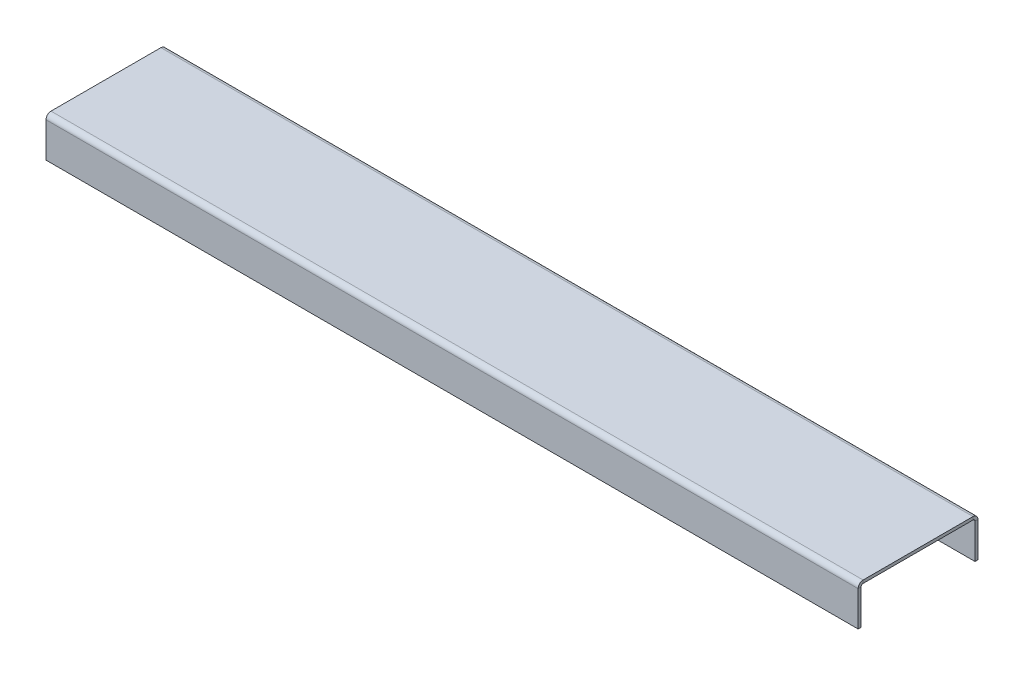
ISO-10303-21;
HEADER;
FILE_DESCRIPTION(('STEP AP214'),'2;1');
FILE_NAME('part.step','',(''),(''),'','','');
FILE_SCHEMA(('AUTOMOTIVE_DESIGN { 1 0 10303 214 1 1 1 1 }'));
ENDSEC;
DATA;
#1=APPLICATION_CONTEXT('core data for automotive mechanical design processes');
#2=APPLICATION_PROTOCOL_DEFINITION('international standard','automotive_design',2000,#1);
#3=PRODUCT_CONTEXT('',#1,'mechanical');
#4=PRODUCT('Part','Part','',(#3));
#5=PRODUCT_RELATED_PRODUCT_CATEGORY('part','',(#4));
#6=PRODUCT_DEFINITION_FORMATION('','',#4);
#7=PRODUCT_DEFINITION_CONTEXT('part definition',#1,'design');
#8=PRODUCT_DEFINITION('design','',#6,#7);
#9=PRODUCT_DEFINITION_SHAPE('','',#8);
#10=(LENGTH_UNIT() NAMED_UNIT(*) SI_UNIT(.MILLI.,.METRE.));
#11=(NAMED_UNIT(*) PLANE_ANGLE_UNIT() SI_UNIT($,.RADIAN.));
#12=(NAMED_UNIT(*) SI_UNIT($,.STERADIAN.) SOLID_ANGLE_UNIT());
#13=UNCERTAINTY_MEASURE_WITH_UNIT(LENGTH_MEASURE(1.E-05),#10,'distance_accuracy_value','');
#14=(GEOMETRIC_REPRESENTATION_CONTEXT(3) GLOBAL_UNCERTAINTY_ASSIGNED_CONTEXT((#13)) GLOBAL_UNIT_ASSIGNED_CONTEXT((#10,
#11,#12)) REPRESENTATION_CONTEXT('',''));
#15=CARTESIAN_POINT('',(0.,0.,0.));
#16=DIRECTION('',(0.,0.,1.));
#17=DIRECTION('',(1.,0.,0.));
#18=AXIS2_PLACEMENT_3D('',#15,#16,#17);
#19=CARTESIAN_POINT('',(436.5,0.,966.246966211492));
#20=DIRECTION('',(0.,-1.,0.));
#21=DIRECTION('',(0.,0.,-1.));
#22=AXIS2_PLACEMENT_3D('',#19,#20,#21);
#23=PLANE('',#22);
#24=DIRECTION('',(0.,0.,1.));
#25=VECTOR('',#24,1.);
#26=CARTESIAN_POINT('',(436.5,0.,966.246966211492));
#27=LINE('',#26,#25);
#28=CARTESIAN_POINT('',(436.5,0.,1778.5));
#29=VERTEX_POINT('',#28);
#30=CARTESIAN_POINT('',(436.5,-4.44089209850063E-13,1780.));
#31=VERTEX_POINT('',#30);
#32=EDGE_CURVE('E234',#29,#31,#27,.T.);
#33=ORIENTED_EDGE('',*,*,#32,.T.);
#34=DIRECTION('',(1.,0.,0.));
#35=VECTOR('',#34,1.);
#36=CARTESIAN_POINT('',(436.5,-6.66133814775094E-13,1780.));
#37=LINE('',#36,#35);
#38=CARTESIAN_POINT('',(30.,-4.44089209850063E-13,1780.));
#39=VERTEX_POINT('',#38);
#40=EDGE_CURVE('E221',#39,#31,#37,.T.);
#41=ORIENTED_EDGE('',*,*,#40,.F.);
#42=DIRECTION('',(0.,0.,1.));
#43=VECTOR('',#42,1.);
#44=CARTESIAN_POINT('',(30.0000000000001,-4.44089209850063E-13,966.246966211492));
#45=LINE('',#44,#43);
#46=CARTESIAN_POINT('',(30.,-4.44089209850063E-13,1778.5));
#47=VERTEX_POINT('',#46);
#48=EDGE_CURVE('E343',#47,#39,#45,.T.);
#49=ORIENTED_EDGE('',*,*,#48,.F.);
#50=DIRECTION('',(1.,0.,0.));
#51=VECTOR('',#50,1.);
#52=CARTESIAN_POINT('',(436.5,0.,1778.5));
#53=LINE('',#52,#51);
#54=EDGE_CURVE('E110',#47,#29,#53,.T.);
#55=ORIENTED_EDGE('',*,*,#54,.T.);
#56=EDGE_LOOP('',(#33,#41,#49,#55));
#57=FACE_BOUND('',#56,.T.);
#58=ADVANCED_FACE('F55',(#57),#23,.T.);
#59=CARTESIAN_POINT('',(436.5,17.4999999999999,966.246966211492));
#60=DIRECTION('',(1.,0.,0.));
#61=DIRECTION('',(0.,0.,1.));
#62=AXIS2_PLACEMENT_3D('',#59,#60,#61);
#63=PLANE('',#62);
#64=DIRECTION('',(0.,0.,1.));
#65=VECTOR('',#64,1.);
#66=CARTESIAN_POINT('',(436.5,17.4999999999999,966.246966211492));
#67=LINE('',#66,#65);
#68=CARTESIAN_POINT('',(436.5,17.4999999999999,1778.5));
#69=VERTEX_POINT('',#68);
#70=CARTESIAN_POINT('',(436.5,17.4999999999999,1780.));
#71=VERTEX_POINT('',#70);
#72=EDGE_CURVE('E203',#69,#71,#67,.T.);
#73=ORIENTED_EDGE('',*,*,#72,.T.);
#74=DIRECTION('',(0.,1.,0.));
#75=VECTOR('',#74,1.);
#76=CARTESIAN_POINT('',(436.5,0.,1780.));
#77=LINE('',#76,#75);
#78=EDGE_CURVE('E206',#31,#71,#77,.T.);
#79=ORIENTED_EDGE('',*,*,#78,.F.);
#80=ORIENTED_EDGE('',*,*,#32,.F.);
#81=DIRECTION('',(0.,1.,0.));
#82=VECTOR('',#81,1.);
#83=CARTESIAN_POINT('',(436.5,17.4999999999999,1778.5));
#84=LINE('',#83,#82);
#85=EDGE_CURVE('E102',#29,#69,#84,.T.);
#86=ORIENTED_EDGE('',*,*,#85,.T.);
#87=EDGE_LOOP('',(#73,#79,#80,#86));
#88=FACE_BOUND('',#87,.T.);
#89=ADVANCED_FACE('F205',(#88),#63,.T.);
#90=CARTESIAN_POINT('',(436.5,0.,1780.));
#91=DIRECTION('',(0.,0.,1.));
#92=DIRECTION('',(1.,0.,0.));
#93=AXIS2_PLACEMENT_3D('',#90,#91,#92);
#94=PLANE('',#93);
#95=ORIENTED_EDGE('',*,*,#78,.T.);
#96=DIRECTION('',(-1.,0.,0.));
#97=VECTOR('',#96,1.);
#98=CARTESIAN_POINT('',(436.5,17.4999999999999,1780.));
#99=LINE('',#98,#97);
#100=CARTESIAN_POINT('',(30.,17.4999999999994,1780.));
#101=VERTEX_POINT('',#100);
#102=EDGE_CURVE('E218',#101,#71,#99,.F.);
#103=ORIENTED_EDGE('',*,*,#102,.F.);
#104=DIRECTION('',(0.,1.,0.));
#105=VECTOR('',#104,1.);
#106=CARTESIAN_POINT('',(30.,0.,1780.));
#107=LINE('',#106,#105);
#108=EDGE_CURVE('E223',#101,#39,#107,.F.);
#109=ORIENTED_EDGE('',*,*,#108,.T.);
#110=ORIENTED_EDGE('',*,*,#40,.T.);
#111=EDGE_LOOP('',(#95,#103,#109,#110));
#112=FACE_BOUND('',#111,.T.);
#113=ADVANCED_FACE('F217',(#112),#94,.T.);
#114=CARTESIAN_POINT('',(30.0000000000001,18.4999999999995,966.246966211492));
#115=DIRECTION('',(-1.,0.,0.));
#116=DIRECTION('',(0.,0.,-1.));
#117=AXIS2_PLACEMENT_3D('',#114,#115,#116);
#118=PLANE('',#117);
#119=ORIENTED_EDGE('',*,*,#48,.T.);
#120=ORIENTED_EDGE('',*,*,#108,.F.);
#121=DIRECTION('',(0.,0.,1.));
#122=VECTOR('',#121,1.);
#123=CARTESIAN_POINT('',(30.0000000000001,17.4999999999994,966.246966211492));
#124=LINE('',#123,#122);
#125=CARTESIAN_POINT('',(30.,17.4999999999994,1778.5));
#126=VERTEX_POINT('',#125);
#127=EDGE_CURVE('E60',#126,#101,#124,.T.);
#128=ORIENTED_EDGE('',*,*,#127,.F.);
#129=DIRECTION('',(0.,-1.,0.));
#130=VECTOR('',#129,1.);
#131=CARTESIAN_POINT('',(30.,18.4999999999995,1778.5));
#132=LINE('',#131,#130);
#133=EDGE_CURVE('E67',#126,#47,#132,.T.);
#134=ORIENTED_EDGE('',*,*,#133,.T.);
#135=EDGE_LOOP('',(#119,#120,#128,#134));
#136=FACE_BOUND('',#135,.T.);
#137=ADVANCED_FACE('F369',(#136),#118,.T.);
#138=CARTESIAN_POINT('',(436.5,0.,1778.5));
#139=DIRECTION('',(0.,0.,1.));
#140=DIRECTION('',(1.,0.,0.));
#141=AXIS2_PLACEMENT_3D('',#138,#139,#140);
#142=PLANE('',#141);
#143=DIRECTION('',(-1.,0.,0.));
#144=VECTOR('',#143,1.);
#145=CARTESIAN_POINT('',(436.5,17.4999999999999,1778.5));
#146=LINE('',#145,#144);
#147=EDGE_CURVE('E12',#126,#69,#146,.F.);
#148=ORIENTED_EDGE('',*,*,#147,.T.);
#149=ORIENTED_EDGE('',*,*,#85,.F.);
#150=ORIENTED_EDGE('',*,*,#54,.F.);
#151=ORIENTED_EDGE('',*,*,#133,.F.);
#152=EDGE_LOOP('',(#148,#149,#150,#151));
#153=FACE_BOUND('',#152,.T.);
#154=ADVANCED_FACE('F58',(#153),#142,.F.);
#155=CARTESIAN_POINT('',(436.5,4.44089209850063E-13,2533.75303378851));
#156=DIRECTION('',(0.,-1.,0.));
#157=DIRECTION('',(0.,0.,-1.));
#158=AXIS2_PLACEMENT_3D('',#155,#156,#157);
#159=PLANE('',#158);
#160=DIRECTION('',(0.,0.,-1.));
#161=VECTOR('',#160,1.);
#162=CARTESIAN_POINT('',(30.0000000000001,0.,2533.75303378851));
#163=LINE('',#162,#161);
#164=CARTESIAN_POINT('',(30.0000000000001,0.,1721.5));
#165=VERTEX_POINT('',#164);
#166=CARTESIAN_POINT('',(30.0000000000001,0.,1720.));
#167=VERTEX_POINT('',#166);
#168=EDGE_CURVE('E335',#165,#167,#163,.T.);
#169=ORIENTED_EDGE('',*,*,#168,.T.);
#170=DIRECTION('',(-1.,0.,0.));
#171=VECTOR('',#170,1.);
#172=CARTESIAN_POINT('',(436.5,4.44089209850063E-13,1720.));
#173=LINE('',#172,#171);
#174=CARTESIAN_POINT('',(436.5,4.44089209850063E-13,1720.));
#175=VERTEX_POINT('',#174);
#176=EDGE_CURVE('E153',#175,#167,#173,.T.);
#177=ORIENTED_EDGE('',*,*,#176,.F.);
#178=DIRECTION('',(0.,0.,-1.));
#179=VECTOR('',#178,1.);
#180=CARTESIAN_POINT('',(436.5,4.44089209850063E-13,2533.75303378851));
#181=LINE('',#180,#179);
#182=CARTESIAN_POINT('',(436.5,4.44089209850063E-13,1721.5));
#183=VERTEX_POINT('',#182);
#184=EDGE_CURVE('E414',#183,#175,#181,.T.);
#185=ORIENTED_EDGE('',*,*,#184,.F.);
#186=DIRECTION('',(1.,0.,0.));
#187=VECTOR('',#186,1.);
#188=CARTESIAN_POINT('',(436.5,4.44089209850063E-13,1721.5));
#189=LINE('',#188,#187);
#190=EDGE_CURVE('E404',#183,#165,#189,.F.);
#191=ORIENTED_EDGE('',*,*,#190,.T.);
#192=EDGE_LOOP('',(#169,#177,#185,#191));
#193=FACE_BOUND('',#192,.T.);
#194=ADVANCED_FACE('F422',(#193),#159,.T.);
#195=CARTESIAN_POINT('',(30.0000000000001,17.4999999999994,2533.75303378851));
#196=DIRECTION('',(1.,0.,0.));
#197=DIRECTION('',(0.,0.,-1.));
#198=AXIS2_PLACEMENT_3D('',#195,#196,#197);
#199=PLANE('',#198);
#200=DIRECTION('',(0.,1.,0.));
#201=VECTOR('',#200,1.);
#202=CARTESIAN_POINT('',(30.0000000000001,20.,1720.));
#203=LINE('',#202,#201);
#204=CARTESIAN_POINT('',(30.,17.4999999999996,1720.));
#205=VERTEX_POINT('',#204);
#206=EDGE_CURVE('E146',#167,#205,#203,.T.);
#207=ORIENTED_EDGE('',*,*,#206,.F.);
#208=ORIENTED_EDGE('',*,*,#168,.F.);
#209=DIRECTION('',(0.,1.,0.));
#210=VECTOR('',#209,1.);
#211=CARTESIAN_POINT('',(30.,17.4999999999994,1721.5));
#212=LINE('',#211,#210);
#213=CARTESIAN_POINT('',(30.,17.4999999999994,1721.5));
#214=VERTEX_POINT('',#213);
#215=EDGE_CURVE('E118',#214,#165,#212,.F.);
#216=ORIENTED_EDGE('',*,*,#215,.F.);
#217=DIRECTION('',(0.,0.,-1.));
#218=VECTOR('',#217,1.);
#219=CARTESIAN_POINT('',(30.0000000000001,17.4999999999994,2533.75303378851));
#220=LINE('',#219,#218);
#221=EDGE_CURVE('E398',#214,#205,#220,.T.);
#222=ORIENTED_EDGE('',*,*,#221,.T.);
#223=EDGE_LOOP('',(#207,#208,#216,#222));
#224=FACE_BOUND('',#223,.T.);
#225=ADVANCED_FACE('F397',(#224),#199,.F.);
#226=CARTESIAN_POINT('',(436.5,19.9999999999998,1720.));
#227=DIRECTION('',(0.,0.,-1.));
#228=DIRECTION('',(-1.,0.,0.));
#229=AXIS2_PLACEMENT_3D('',#226,#227,#228);
#230=PLANE('',#229);
#231=DIRECTION('',(0.,1.,0.));
#232=VECTOR('',#231,1.);
#233=CARTESIAN_POINT('',(436.5,19.9999999999998,1720.));
#234=LINE('',#233,#232);
#235=CARTESIAN_POINT('',(436.5,17.4999999999999,1720.));
#236=VERTEX_POINT('',#235);
#237=EDGE_CURVE('E403',#236,#175,#234,.F.);
#238=ORIENTED_EDGE('',*,*,#237,.T.);
#239=ORIENTED_EDGE('',*,*,#176,.T.);
#240=ORIENTED_EDGE('',*,*,#206,.T.);
#241=DIRECTION('',(-1.,0.,0.));
#242=VECTOR('',#241,1.);
#243=CARTESIAN_POINT('',(436.5,17.4999999999999,1720.));
#244=LINE('',#243,#242);
#245=EDGE_CURVE('E329',#236,#205,#244,.T.);
#246=ORIENTED_EDGE('',*,*,#245,.F.);
#247=EDGE_LOOP('',(#238,#239,#240,#246));
#248=FACE_BOUND('',#247,.T.);
#249=ADVANCED_FACE('F426',(#248),#230,.T.);
#250=CARTESIAN_POINT('',(436.5,18.5,2533.75303378851));
#251=DIRECTION('',(1.,0.,0.));
#252=DIRECTION('',(0.,0.,-1.));
#253=AXIS2_PLACEMENT_3D('',#250,#251,#252);
#254=PLANE('',#253);
#255=ORIENTED_EDGE('',*,*,#184,.T.);
#256=ORIENTED_EDGE('',*,*,#237,.F.);
#257=DIRECTION('',(0.,0.,-1.));
#258=VECTOR('',#257,1.);
#259=CARTESIAN_POINT('',(436.5,17.4999999999999,2533.75303378851));
#260=LINE('',#259,#258);
#261=CARTESIAN_POINT('',(436.5,17.4999999999999,1721.5));
#262=VERTEX_POINT('',#261);
#263=EDGE_CURVE('E289',#262,#236,#260,.T.);
#264=ORIENTED_EDGE('',*,*,#263,.F.);
#265=DIRECTION('',(0.,1.,0.));
#266=VECTOR('',#265,1.);
#267=CARTESIAN_POINT('',(436.5,18.5,1721.5));
#268=LINE('',#267,#266);
#269=EDGE_CURVE('E296',#262,#183,#268,.F.);
#270=ORIENTED_EDGE('',*,*,#269,.T.);
#271=EDGE_LOOP('',(#255,#256,#264,#270));
#272=FACE_BOUND('',#271,.T.);
#273=ADVANCED_FACE('F421',(#272),#254,.T.);
#274=CARTESIAN_POINT('',(436.5,19.9999999999998,1721.5));
#275=DIRECTION('',(0.,0.,-1.));
#276=DIRECTION('',(-1.,0.,0.));
#277=AXIS2_PLACEMENT_3D('',#274,#275,#276);
#278=PLANE('',#277);
#279=ORIENTED_EDGE('',*,*,#190,.F.);
#280=ORIENTED_EDGE('',*,*,#269,.F.);
#281=DIRECTION('',(-1.,0.,0.));
#282=VECTOR('',#281,1.);
#283=CARTESIAN_POINT('',(436.5,17.4999999999999,1721.5));
#284=LINE('',#283,#282);
#285=EDGE_CURVE('E292',#262,#214,#284,.T.);
#286=ORIENTED_EDGE('',*,*,#285,.T.);
#287=ORIENTED_EDGE('',*,*,#215,.T.);
#288=EDGE_LOOP('',(#279,#280,#286,#287));
#289=FACE_BOUND('',#288,.T.);
#290=ADVANCED_FACE('F393',(#289),#278,.F.);
#291=CARTESIAN_POINT('',(436.5,19.9999999999999,1780.));
#292=DIRECTION('',(0.,1.,0.));
#293=DIRECTION('',(-1.,0.,0.));
#294=AXIS2_PLACEMENT_3D('',#291,#292,#293);
#295=PLANE('',#294);
#296=DIRECTION('',(0.,0.,1.));
#297=VECTOR('',#296,1.);
#298=CARTESIAN_POINT('',(436.5,19.9999999999999,1780.));
#299=LINE('',#298,#297);
#300=CARTESIAN_POINT('',(436.5,19.9999999999999,1777.5));
#301=VERTEX_POINT('',#300);
#302=CARTESIAN_POINT('',(436.5,19.9999999999999,1722.5));
#303=VERTEX_POINT('',#302);
#304=EDGE_CURVE('E313',#301,#303,#299,.F.);
#305=ORIENTED_EDGE('',*,*,#304,.T.);
#306=DIRECTION('',(-1.,0.,0.));
#307=VECTOR('',#306,1.);
#308=CARTESIAN_POINT('',(436.5,19.9999999999999,1722.5));
#309=LINE('',#308,#307);
#310=CARTESIAN_POINT('',(30.,19.9999999999994,1722.5));
#311=VERTEX_POINT('',#310);
#312=EDGE_CURVE('E165',#303,#311,#309,.T.);
#313=ORIENTED_EDGE('',*,*,#312,.T.);
#314=DIRECTION('',(0.,0.,1.));
#315=VECTOR('',#314,1.);
#316=CARTESIAN_POINT('',(30.,19.9999999999994,1780.));
#317=LINE('',#316,#315);
#318=CARTESIAN_POINT('',(30.,19.9999999999994,1777.5));
#319=VERTEX_POINT('',#318);
#320=EDGE_CURVE('E325',#311,#319,#317,.T.);
#321=ORIENTED_EDGE('',*,*,#320,.T.);
#322=DIRECTION('',(-1.,0.,0.));
#323=VECTOR('',#322,1.);
#324=CARTESIAN_POINT('',(436.5,19.9999999999999,1777.5));
#325=LINE('',#324,#323);
#326=EDGE_CURVE('E265',#319,#301,#325,.F.);
#327=ORIENTED_EDGE('',*,*,#326,.T.);
#328=EDGE_LOOP('',(#305,#313,#321,#327));
#329=FACE_BOUND('',#328,.T.);
#330=ADVANCED_FACE('F473',(#329),#295,.T.);
#331=CARTESIAN_POINT('',(436.500000000001,-800.407825413678,1778.5));
#332=DIRECTION('',(1.,0.,0.));
#333=DIRECTION('',(0.,1.,0.));
#334=AXIS2_PLACEMENT_3D('',#331,#332,#333);
#335=PLANE('',#334);
#336=DIRECTION('',(0.,1.,0.));
#337=VECTOR('',#336,1.);
#338=CARTESIAN_POINT('',(436.500000000001,-800.407825413678,1722.5));
#339=LINE('',#338,#337);
#340=CARTESIAN_POINT('',(436.5,18.4999999999999,1722.5));
#341=VERTEX_POINT('',#340);
#342=EDGE_CURVE('E286',#341,#303,#339,.T.);
#343=ORIENTED_EDGE('',*,*,#342,.T.);
#344=ORIENTED_EDGE('',*,*,#304,.F.);
#345=DIRECTION('',(0.,1.,0.));
#346=VECTOR('',#345,1.);
#347=CARTESIAN_POINT('',(436.500000000001,-800.407825413678,1777.5));
#348=LINE('',#347,#346);
#349=CARTESIAN_POINT('',(436.5,18.4999999999998,1777.5));
#350=VERTEX_POINT('',#349);
#351=EDGE_CURVE('E237',#350,#301,#348,.T.);
#352=ORIENTED_EDGE('',*,*,#351,.F.);
#353=DIRECTION('',(0.,0.,1.));
#354=VECTOR('',#353,1.);
#355=CARTESIAN_POINT('',(436.5,18.4999999999999,1778.5));
#356=LINE('',#355,#354);
#357=EDGE_CURVE('E175',#350,#341,#356,.F.);
#358=ORIENTED_EDGE('',*,*,#357,.T.);
#359=EDGE_LOOP('',(#343,#344,#352,#358));
#360=FACE_BOUND('',#359,.T.);
#361=ADVANCED_FACE('F464',(#360),#335,.T.);
#362=CARTESIAN_POINT('',(30.000000000001,-800.407825413679,1721.5));
#363=DIRECTION('',(-1.,0.,0.));
#364=DIRECTION('',(0.,-1.,0.));
#365=AXIS2_PLACEMENT_3D('',#362,#363,#364);
#366=PLANE('',#365);
#367=DIRECTION('',(0.,1.,0.));
#368=VECTOR('',#367,1.);
#369=CARTESIAN_POINT('',(30.0000000000011,-800.407825413679,1777.5));
#370=LINE('',#369,#368);
#371=CARTESIAN_POINT('',(30.,18.4999999999993,1777.5));
#372=VERTEX_POINT('',#371);
#373=EDGE_CURVE('E280',#372,#319,#370,.T.);
#374=ORIENTED_EDGE('',*,*,#373,.T.);
#375=ORIENTED_EDGE('',*,*,#320,.F.);
#376=DIRECTION('',(0.,1.,0.));
#377=VECTOR('',#376,1.);
#378=CARTESIAN_POINT('',(30.0000000000011,-800.407825413679,1722.5));
#379=LINE('',#378,#377);
#380=CARTESIAN_POINT('',(30.,18.4999999999995,1722.5));
#381=VERTEX_POINT('',#380);
#382=EDGE_CURVE('E276',#381,#311,#379,.T.);
#383=ORIENTED_EDGE('',*,*,#382,.F.);
#384=DIRECTION('',(0.,0.,1.));
#385=VECTOR('',#384,1.);
#386=CARTESIAN_POINT('',(30.,18.4999999999994,1721.5));
#387=LINE('',#386,#385);
#388=EDGE_CURVE('E272',#381,#372,#387,.T.);
#389=ORIENTED_EDGE('',*,*,#388,.T.);
#390=EDGE_LOOP('',(#374,#375,#383,#389));
#391=FACE_BOUND('',#390,.T.);
#392=ADVANCED_FACE('F378',(#391),#366,.T.);
#393=CARTESIAN_POINT('',(436.5,18.4999999999999,1780.));
#394=DIRECTION('',(0.,1.,0.));
#395=DIRECTION('',(-1.,0.,0.));
#396=AXIS2_PLACEMENT_3D('',#393,#394,#395);
#397=PLANE('',#396);
#398=DIRECTION('',(-1.,0.,0.));
#399=VECTOR('',#398,1.);
#400=CARTESIAN_POINT('',(436.5,18.4999999999999,1722.5));
#401=LINE('',#400,#399);
#402=EDGE_CURVE('E259',#341,#381,#401,.T.);
#403=ORIENTED_EDGE('',*,*,#402,.F.);
#404=ORIENTED_EDGE('',*,*,#357,.F.);
#405=DIRECTION('',(-1.,0.,0.));
#406=VECTOR('',#405,1.);
#407=CARTESIAN_POINT('',(436.5,18.4999999999999,1777.5));
#408=LINE('',#407,#406);
#409=EDGE_CURVE('E269',#372,#350,#408,.F.);
#410=ORIENTED_EDGE('',*,*,#409,.F.);
#411=ORIENTED_EDGE('',*,*,#388,.F.);
#412=EDGE_LOOP('',(#403,#404,#410,#411));
#413=FACE_BOUND('',#412,.T.);
#414=ADVANCED_FACE('F382',(#413),#397,.F.);
#415=CARTESIAN_POINT('',(30.,17.4999999999995,1722.5));
#416=DIRECTION('',(-1.,0.,0.));
#417=DIRECTION('',(0.,0.,1.));
#418=AXIS2_PLACEMENT_3D('',#415,#416,#417);
#419=PLANE('',#418);
#420=ORIENTED_EDGE('',*,*,#221,.F.);
#421=CARTESIAN_POINT('',(30.,17.4999999999995,1722.5));
#422=DIRECTION('',(1.,0.,0.));
#423=DIRECTION('',(0.,1.,0.));
#424=AXIS2_PLACEMENT_3D('',#421,#422,#423);
#425=CIRCLE('',#424,1.00000000000006);
#426=EDGE_CURVE('E243',#214,#381,#425,.T.);
#427=ORIENTED_EDGE('',*,*,#426,.T.);
#428=ORIENTED_EDGE('',*,*,#382,.T.);
#429=CARTESIAN_POINT('',(30.,17.4999999999995,1722.5));
#430=DIRECTION('',(1.,0.,0.));
#431=DIRECTION('',(0.,1.,0.));
#432=AXIS2_PLACEMENT_3D('',#429,#430,#431);
#433=CIRCLE('',#432,2.50000000000006);
#434=EDGE_CURVE('E304',#205,#311,#433,.T.);
#435=ORIENTED_EDGE('',*,*,#434,.F.);
#436=EDGE_LOOP('',(#420,#427,#428,#435));
#437=FACE_BOUND('',#436,.T.);
#438=ADVANCED_FACE('F401',(#437),#419,.T.);
#439=CARTESIAN_POINT('',(436.5,17.4999999999999,1722.5));
#440=DIRECTION('',(1.,0.,0.));
#441=DIRECTION('',(0.,0.,-1.));
#442=AXIS2_PLACEMENT_3D('',#439,#440,#441);
#443=PLANE('',#442);
#444=CARTESIAN_POINT('',(436.5,17.4999999999999,1722.5));
#445=DIRECTION('',(1.,0.,0.));
#446=DIRECTION('',(0.,1.,0.));
#447=AXIS2_PLACEMENT_3D('',#444,#445,#446);
#448=CIRCLE('',#447,1.00000000000006);
#449=EDGE_CURVE('E310',#341,#262,#448,.F.);
#450=ORIENTED_EDGE('',*,*,#449,.T.);
#451=ORIENTED_EDGE('',*,*,#263,.T.);
#452=CARTESIAN_POINT('',(436.5,17.4999999999999,1722.5));
#453=DIRECTION('',(1.,0.,0.));
#454=DIRECTION('',(0.,1.,0.));
#455=AXIS2_PLACEMENT_3D('',#452,#453,#454);
#456=CIRCLE('',#455,2.50000000000006);
#457=EDGE_CURVE('E309',#303,#236,#456,.F.);
#458=ORIENTED_EDGE('',*,*,#457,.F.);
#459=ORIENTED_EDGE('',*,*,#342,.F.);
#460=EDGE_LOOP('',(#450,#451,#458,#459));
#461=FACE_BOUND('',#460,.T.);
#462=ADVANCED_FACE('F389',(#461),#443,.T.);
#463=CARTESIAN_POINT('',(-387.365139895511,17.499999999999,1722.5));
#464=DIRECTION('',(1.,0.,0.));
#465=DIRECTION('',(0.,1.,0.));
#466=AXIS2_PLACEMENT_3D('',#463,#464,#465);
#467=CYLINDRICAL_SURFACE('',#466,2.50000000000006);
#468=ORIENTED_EDGE('',*,*,#312,.F.);
#469=ORIENTED_EDGE('',*,*,#457,.T.);
#470=ORIENTED_EDGE('',*,*,#245,.T.);
#471=ORIENTED_EDGE('',*,*,#434,.T.);
#472=EDGE_LOOP('',(#468,#469,#470,#471));
#473=FACE_BOUND('',#472,.T.);
#474=ADVANCED_FACE('F428',(#473),#467,.T.);
#475=CARTESIAN_POINT('',(-387.365139895511,17.499999999999,1722.5));
#476=DIRECTION('',(1.,0.,0.));
#477=DIRECTION('',(0.,1.,0.));
#478=AXIS2_PLACEMENT_3D('',#475,#476,#477);
#479=CYLINDRICAL_SURFACE('',#478,1.00000000000006);
#480=ORIENTED_EDGE('',*,*,#402,.T.);
#481=ORIENTED_EDGE('',*,*,#426,.F.);
#482=ORIENTED_EDGE('',*,*,#285,.F.);
#483=ORIENTED_EDGE('',*,*,#449,.F.);
#484=EDGE_LOOP('',(#480,#481,#482,#483));
#485=FACE_BOUND('',#484,.T.);
#486=ADVANCED_FACE('F392',(#485),#479,.F.);
#487=CARTESIAN_POINT('',(436.5,17.4999999999998,1777.5));
#488=DIRECTION('',(1.,0.,0.));
#489=DIRECTION('',(0.,1.,0.));
#490=AXIS2_PLACEMENT_3D('',#487,#488,#489);
#491=PLANE('',#490);
#492=ORIENTED_EDGE('',*,*,#72,.F.);
#493=CARTESIAN_POINT('',(436.5,17.4999999999998,1777.5));
#494=DIRECTION('',(-1.,0.,0.));
#495=DIRECTION('',(0.,-1.,0.));
#496=AXIS2_PLACEMENT_3D('',#493,#494,#495);
#497=CIRCLE('',#496,1.00000000000001);
#498=EDGE_CURVE('E246',#69,#350,#497,.T.);
#499=ORIENTED_EDGE('',*,*,#498,.T.);
#500=ORIENTED_EDGE('',*,*,#351,.T.);
#501=CARTESIAN_POINT('',(436.5,17.4999999999998,1777.5));
#502=DIRECTION('',(-1.,0.,0.));
#503=DIRECTION('',(0.,-1.,0.));
#504=AXIS2_PLACEMENT_3D('',#501,#502,#503);
#505=CIRCLE('',#504,2.50000000000001);
#506=EDGE_CURVE('E230',#71,#301,#505,.T.);
#507=ORIENTED_EDGE('',*,*,#506,.F.);
#508=EDGE_LOOP('',(#492,#499,#500,#507));
#509=FACE_BOUND('',#508,.T.);
#510=ADVANCED_FACE('F236',(#509),#491,.T.);
#511=CARTESIAN_POINT('',(30.,17.4999999999993,1777.5));
#512=DIRECTION('',(-1.,0.,0.));
#513=DIRECTION('',(0.,0.,1.));
#514=AXIS2_PLACEMENT_3D('',#511,#512,#513);
#515=PLANE('',#514);
#516=CARTESIAN_POINT('',(30.,17.4999999999993,1777.5));
#517=DIRECTION('',(-1.,0.,0.));
#518=DIRECTION('',(0.,-1.,0.));
#519=AXIS2_PLACEMENT_3D('',#516,#517,#518);
#520=CIRCLE('',#519,1.00000000000001);
#521=EDGE_CURVE('E239',#372,#126,#520,.F.);
#522=ORIENTED_EDGE('',*,*,#521,.T.);
#523=ORIENTED_EDGE('',*,*,#127,.T.);
#524=CARTESIAN_POINT('',(30.,17.4999999999993,1777.5));
#525=DIRECTION('',(-1.,0.,0.));
#526=DIRECTION('',(0.,-1.,0.));
#527=AXIS2_PLACEMENT_3D('',#524,#525,#526);
#528=CIRCLE('',#527,2.50000000000001);
#529=EDGE_CURVE('E232',#319,#101,#528,.F.);
#530=ORIENTED_EDGE('',*,*,#529,.F.);
#531=ORIENTED_EDGE('',*,*,#373,.F.);
#532=EDGE_LOOP('',(#522,#523,#530,#531));
#533=FACE_BOUND('',#532,.T.);
#534=ADVANCED_FACE('F376',(#533),#515,.T.);
#535=CARTESIAN_POINT('',(850.767473982692,17.5000000000003,1777.5));
#536=DIRECTION('',(-1.,0.,0.));
#537=DIRECTION('',(0.,-1.,0.));
#538=AXIS2_PLACEMENT_3D('',#535,#536,#537);
#539=CYLINDRICAL_SURFACE('',#538,2.50000000000001);
#540=ORIENTED_EDGE('',*,*,#326,.F.);
#541=ORIENTED_EDGE('',*,*,#529,.T.);
#542=ORIENTED_EDGE('',*,*,#102,.T.);
#543=ORIENTED_EDGE('',*,*,#506,.T.);
#544=EDGE_LOOP('',(#540,#541,#542,#543));
#545=FACE_BOUND('',#544,.T.);
#546=ADVANCED_FACE('F229',(#545),#539,.T.);
#547=CARTESIAN_POINT('',(850.767473982692,17.5000000000003,1777.5));
#548=DIRECTION('',(-1.,0.,0.));
#549=DIRECTION('',(0.,-1.,0.));
#550=AXIS2_PLACEMENT_3D('',#547,#548,#549);
#551=CYLINDRICAL_SURFACE('',#550,1.00000000000001);
#552=ORIENTED_EDGE('',*,*,#409,.T.);
#553=ORIENTED_EDGE('',*,*,#498,.F.);
#554=ORIENTED_EDGE('',*,*,#147,.F.);
#555=ORIENTED_EDGE('',*,*,#521,.F.);
#556=EDGE_LOOP('',(#552,#553,#554,#555));
#557=FACE_BOUND('',#556,.T.);
#558=ADVANCED_FACE('F374',(#557),#551,.F.);
#559=CLOSED_SHELL('',(#58,#89,#113,#137,#154,#194,#225,#249,#273,#290,#330,#361,#392,#414,#438,
#462,#474,#486,#510,#534,#546,#558));
#560=MANIFOLD_SOLID_BREP('B2',#559);
#561=ADVANCED_BREP_SHAPE_REPRESENTATION('',(#18,#560),#14);
#562=SHAPE_DEFINITION_REPRESENTATION(#9,#561);
ENDSEC;
END-ISO-10303-21;
